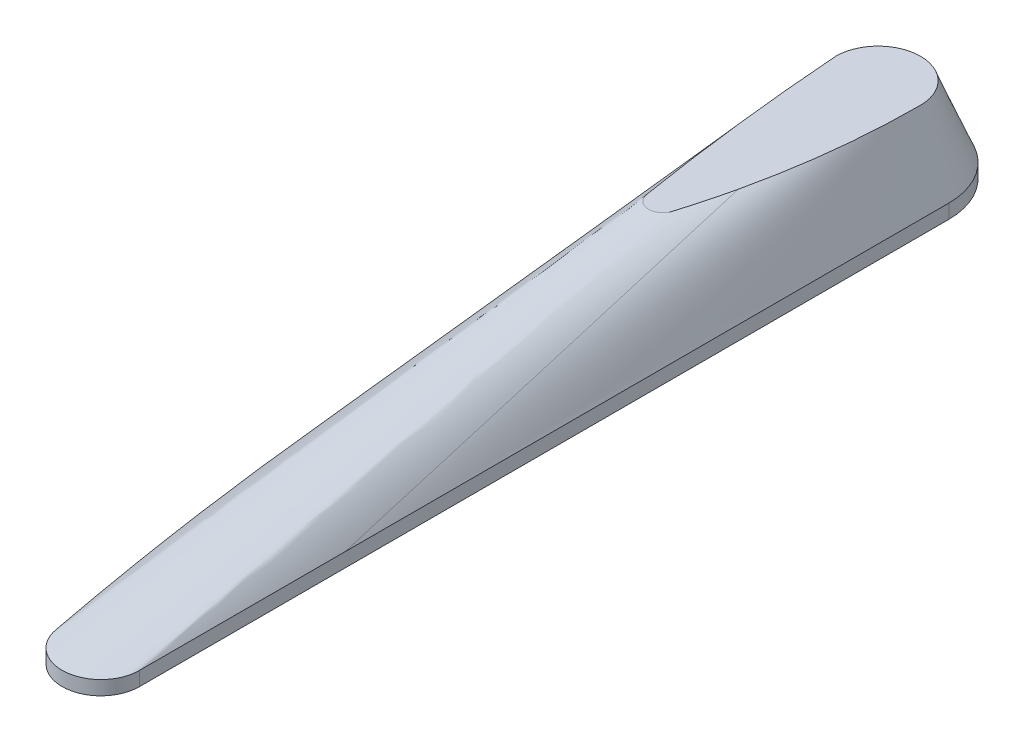
ISO-10303-21;
HEADER;
FILE_DESCRIPTION(('STEP AP214'),'2;1');
FILE_NAME('part.step','',(''),(''),'','','');
FILE_SCHEMA(('AUTOMOTIVE_DESIGN { 1 0 10303 214 1 1 1 1 }'));
ENDSEC;
DATA;
#1=APPLICATION_CONTEXT('core data for automotive mechanical design processes');
#2=APPLICATION_PROTOCOL_DEFINITION('international standard','automotive_design',2000,#1);
#3=PRODUCT_CONTEXT('',#1,'mechanical');
#4=PRODUCT('Part','Part','',(#3));
#5=PRODUCT_RELATED_PRODUCT_CATEGORY('part','',(#4));
#6=PRODUCT_DEFINITION_FORMATION('','',#4);
#7=PRODUCT_DEFINITION_CONTEXT('part definition',#1,'design');
#8=PRODUCT_DEFINITION('design','',#6,#7);
#9=PRODUCT_DEFINITION_SHAPE('','',#8);
#10=(LENGTH_UNIT() NAMED_UNIT(*) SI_UNIT(.MILLI.,.METRE.));
#11=(NAMED_UNIT(*) PLANE_ANGLE_UNIT() SI_UNIT($,.RADIAN.));
#12=(NAMED_UNIT(*) SI_UNIT($,.STERADIAN.) SOLID_ANGLE_UNIT());
#13=UNCERTAINTY_MEASURE_WITH_UNIT(LENGTH_MEASURE(1.E-05),#10,'distance_accuracy_value','');
#14=(GEOMETRIC_REPRESENTATION_CONTEXT(3) GLOBAL_UNCERTAINTY_ASSIGNED_CONTEXT((#13)) GLOBAL_UNIT_ASSIGNED_CONTEXT((#10,
#11,#12)) REPRESENTATION_CONTEXT('',''));
#15=CARTESIAN_POINT('',(0.,0.,0.));
#16=DIRECTION('',(0.,0.,1.));
#17=DIRECTION('',(1.,0.,0.));
#18=AXIS2_PLACEMENT_3D('',#15,#16,#17);
#19=CARTESIAN_POINT('',(0.,5.,0.));
#20=DIRECTION('',(0.,-1.,0.));
#21=DIRECTION('',(0.,0.,-1.));
#22=AXIS2_PLACEMENT_3D('',#19,#20,#21);
#23=CYLINDRICAL_SURFACE('',#22,25.);
#24=CARTESIAN_POINT('',(0.,0.,0.));
#25=DIRECTION('',(0.,1.,0.));
#26=DIRECTION('',(0.,0.,1.));
#27=AXIS2_PLACEMENT_3D('',#24,#25,#26);
#28=CIRCLE('',#27,25.);
#29=CARTESIAN_POINT('',(25.,0.,0.));
#30=VERTEX_POINT('',#29);
#31=CARTESIAN_POINT('',(-25.,0.,0.));
#32=VERTEX_POINT('',#31);
#33=EDGE_CURVE('E451',#30,#32,#28,.T.);
#34=ORIENTED_EDGE('',*,*,#33,.T.);
#35=DIRECTION('',(0.,-1.,0.));
#36=VECTOR('',#35,1.);
#37=CARTESIAN_POINT('',(-25.,5.,0.));
#38=LINE('',#37,#36);
#39=CARTESIAN_POINT('',(-25.,5.,0.));
#40=VERTEX_POINT('',#39);
#41=EDGE_CURVE('E210',#40,#32,#38,.T.);
#42=ORIENTED_EDGE('',*,*,#41,.F.);
#43=CARTESIAN_POINT('',(25.,5.,0.));
#44=CARTESIAN_POINT('',(25.0000015287042,5.00001981175382,-0.265039677965783));
#45=CARTESIAN_POINT('',(24.9957852937944,5.00008696261253,-0.530079262790571));
#46=CARTESIAN_POINT('',(24.9789282878148,5.00021539854403,-1.05989005646571));
#47=CARTESIAN_POINT('',(24.966287527747,5.00027668362449,-1.32466126566609));
#48=CARTESIAN_POINT('',(24.9325919216827,5.00029284484016,-1.85367630226396));
#49=CARTESIAN_POINT('',(24.9115368056182,5.00024771755972,-2.1179201124604));
#50=CARTESIAN_POINT('',(24.8610342903872,5.00008687217403,-2.64560447476436));
#51=CARTESIAN_POINT('',(24.8315868908788,4.99997115406589,-2.90904502683916));
#52=CARTESIAN_POINT('',(24.7643284730527,4.99986193749069,-3.43486380096899));
#53=CARTESIAN_POINT('',(24.7265172273807,4.99986844234642,-3.69724199394845));
#54=CARTESIAN_POINT('',(24.6425701645537,4.99990952299622,-4.22066240605161));
#55=CARTESIAN_POINT('',(24.596434352913,4.99994409877171,-4.48170462606014));
#56=CARTESIAN_POINT('',(24.4959868319933,4.99996614882493,-5.00165883415569));
#57=CARTESIAN_POINT('',(24.441692074504,4.99995371950034,-5.2605740918478));
#58=CARTESIAN_POINT('',(24.3249159442578,4.99991296459885,-5.77654248561465));
#59=CARTESIAN_POINT('',(24.2624345541098,4.99988463898817,-6.03359561773237));
#60=CARTESIAN_POINT('',(24.0628105820831,4.99992841412283,-6.80153307841493));
#61=CARTESIAN_POINT('',(23.9134676456348,5.00012920262583,-7.30930182952002));
#62=CARTESIAN_POINT('',(23.5828921816287,5.00024535469539,-8.31426380576913));
#63=CARTESIAN_POINT('',(23.4016637479709,5.00016075487872,-8.81145837939717));
#64=CARTESIAN_POINT('',(23.0740745298648,5.00002286059824,-9.62863859327918));
#65=CARTESIAN_POINT('',(22.9364029975503,4.9999685823108,-9.95213470523461));
#66=CARTESIAN_POINT('',(22.6475308637945,4.99980480485229,-10.5930587405172));
#67=CARTESIAN_POINT('',(22.4963296366114,4.99969530312607,-10.9104863823557));
#68=CARTESIAN_POINT('',(22.1806908907823,4.99964565142405,-11.5386525052447));
#69=CARTESIAN_POINT('',(22.0162545531562,4.99970548635393,-11.8493915800124));
#70=CARTESIAN_POINT('',(21.6744273575486,4.99992745401653,-12.4636566488229));
#71=CARTESIAN_POINT('',(21.4970366588587,5.00008958549157,-12.7671827314983));
#72=CARTESIAN_POINT('',(21.129684004616,5.00031098116639,-13.3663720495733));
#73=CARTESIAN_POINT('',(20.9397268137994,5.00037028412539,-13.6620382062224));
#74=CARTESIAN_POINT('',(20.5475184943943,5.00036035989201,-14.2451020402767));
#75=CARTESIAN_POINT('',(20.3452673271103,5.00029113229506,-14.5324996916524));
#76=CARTESIAN_POINT('',(19.9288277598403,5.00007417336098,-15.0985189362524));
#77=CARTESIAN_POINT('',(19.7146391940336,4.99992644093311,-15.3771404074839));
#78=CARTESIAN_POINT('',(19.2747099629383,4.99976056888378,-15.9251063539823));
#79=CARTESIAN_POINT('',(19.0489693071228,4.99974242915606,-16.1944508368565));
#80=CARTESIAN_POINT('',(18.5863088833614,4.9997991406477,-16.7234141534915));
#81=CARTESIAN_POINT('',(18.3493880703777,4.99987400057661,-16.9830320740008));
#82=CARTESIAN_POINT('',(17.864832118495,4.9999910960057,-17.4920350921682));
#83=CARTESIAN_POINT('',(17.6171969771167,5.00003333149832,-17.7414201874585));
#84=CARTESIAN_POINT('',(16.8588594339111,5.00006369450702,-18.4735582413242));
#85=CARTESIAN_POINT('',(16.3326204772326,4.99995554090268,-18.9404133422297));
#86=CARTESIAN_POINT('',(15.2426431650757,4.99995802787102,-19.828165765331));
#87=CARTESIAN_POINT('',(14.6788968915958,5.00006871478467,-20.249053333673));
#88=CARTESIAN_POINT('',(13.5179292312595,5.000098818153,-21.0418536144358));
#89=CARTESIAN_POINT('',(12.9207078264022,5.00001823450483,-21.4137663005204));
#90=CARTESIAN_POINT('',(11.697100047189,4.99995386062134,-22.1059250529023));
#91=CARTESIAN_POINT('',(11.0707156108498,4.99997006396318,-22.4261745461576));
#92=CARTESIAN_POINT('',(9.79319264161883,4.99998681037201,-23.0127661592833));
#93=CARTESIAN_POINT('',(9.14205411287923,4.99998735344163,-23.279108288196));
#94=CARTESIAN_POINT('',(7.81970568938631,4.99999282721948,-23.7559712207486));
#95=CARTESIAN_POINT('',(7.14849736419536,4.99999775758545,-23.9664963769264));
#96=CARTESIAN_POINT('',(5.79073196242021,5.00000599903994,-24.3302565618919));
#97=CARTESIAN_POINT('',(5.10417488645565,5.00000931012853,-24.4834915929925));
#98=CARTESIAN_POINT('',(3.7205742289236,5.00000239914589,-24.7315853961882));
#99=CARTESIAN_POINT('',(3.02353036798465,4.99999217671349,-24.8264426102476));
#100=CARTESIAN_POINT('',(1.62392943637039,5.00000112695916,-24.9571000255161));
#101=CARTESIAN_POINT('',(0.921372365362157,5.000020299639,-24.992900223159));
#102=CARTESIAN_POINT('',(-0.484277797098271,5.00004564161192,-25.0051892237259));
#103=CARTESIAN_POINT('',(-1.18737090143737,5.00005181058185,-24.9816765526637));
#104=CARTESIAN_POINT('',(-2.589076964091,5.00001228082691,-24.8755038882613));
#105=CARTESIAN_POINT('',(-3.28768992242217,4.99996658210222,-24.7928438951409));
#106=CARTESIAN_POINT('',(-4.67545916106184,4.99990158114059,-24.5689658029882));
#107=CARTESIAN_POINT('',(-5.36461557370601,4.99988227853388,-24.4277485242766));
#108=CARTESIAN_POINT('',(-6.72858212160635,4.99988115736163,-24.0877600219821));
#109=CARTESIAN_POINT('',(-7.40339225690107,4.99989933879599,-23.8889887985539));
#110=CARTESIAN_POINT('',(-8.73387139010403,4.99994709338837,-23.4353043497546));
#111=CARTESIAN_POINT('',(-9.38954032537246,4.99997666658367,-23.1803909406808));
#112=CARTESIAN_POINT('',(-10.6770716401497,5.00006369072572,-22.6162364921899));
#113=CARTESIAN_POINT('',(-11.3089340209416,5.00012114167096,-22.3069954557009));
#114=CARTESIAN_POINT('',(-12.5443905545814,5.00023152038039,-21.6363647559758));
#115=CARTESIAN_POINT('',(-13.1479835940585,5.00028444796649,-21.2749730411011));
#116=CARTESIAN_POINT('',(-14.3225607583811,5.00027024933434,-20.5026428911266));
#117=CARTESIAN_POINT('',(-14.8935448676276,5.00020312305865,-20.091704432326));
#118=CARTESIAN_POINT('',(-15.9988844289143,4.99993489899596,-19.2231504216806));
#119=CARTESIAN_POINT('',(-16.5332428630122,4.99973381213032,-18.7655386775351));
#120=CARTESIAN_POINT('',(-17.3043159474236,4.99960685432677,-18.0467250351844));
#121=CARTESIAN_POINT('',(-17.5562889073458,4.99959365529618,-17.8016924298901));
#122=CARTESIAN_POINT('',(-18.0496997822869,4.99962816307563,-17.3012072998152));
#123=CARTESIAN_POINT('',(-18.2911376975114,4.99967586988448,-17.0457547752379));
#124=CARTESIAN_POINT('',(-18.7629797950295,4.99977941641623,-16.5249523493818));
#125=CARTESIAN_POINT('',(-18.9933860722288,4.99983525458678,-16.2596043444144));
#126=CARTESIAN_POINT('',(-19.4428111118705,4.99993507183714,-15.7194316952326));
#127=CARTESIAN_POINT('',(-19.6618298749208,4.99997905091758,-15.4446070515243));
#128=CARTESIAN_POINT('',(-20.088090848164,5.00006761015988,-14.8859683223212));
#129=CARTESIAN_POINT('',(-20.2953329495302,5.00011219032729,-14.6021541537929));
#130=CARTESIAN_POINT('',(-20.6976705476457,5.00022119031622,-14.026042860349));
#131=CARTESIAN_POINT('',(-20.8927660435556,5.0002856101391,-13.7337457348471));
#132=CARTESIAN_POINT('',(-21.2705523313112,5.00035819783342,-13.1410488438472));
#133=CARTESIAN_POINT('',(-21.4532372496603,5.00036633925134,-12.8406453345591));
#134=CARTESIAN_POINT('',(-21.8057769035779,5.00031327163407,-12.2324018374529));
#135=CARTESIAN_POINT('',(-21.975631636644,5.00025206258535,-11.9245618481842));
#136=CARTESIAN_POINT('',(-22.3022026829812,5.00008554583951,-11.3020045783023));
#137=CARTESIAN_POINT('',(-22.4589194805743,4.99998023976887,-10.9872875517466));
#138=CARTESIAN_POINT('',(-22.75894280124,4.99986033031918,-10.3515252236371));
#139=CARTESIAN_POINT('',(-22.9022493306535,4.99984572689724,-10.0304799250758));
#140=CARTESIAN_POINT('',(-23.1752976569481,4.99987131508436,-9.38239373319895));
#141=CARTESIAN_POINT('',(-23.3050294005145,4.99991154699881,-9.05534860422486));
#142=CARTESIAN_POINT('',(-23.5505768214901,4.99992984066663,-8.39607441994292));
#143=CARTESIAN_POINT('',(-23.6663924661647,4.99990790227378,-8.06384535244304));
#144=CARTESIAN_POINT('',(-23.883917887997,4.99980719022747,-7.39474401482791));
#145=CARTESIAN_POINT('',(-23.9856254736931,4.99972840775595,-7.05787103226942));
#146=CARTESIAN_POINT('',(-24.1747314931062,4.999582390758,-6.38013539839121));
#147=CARTESIAN_POINT('',(-24.2621300465628,4.99951515613494,-6.03927278048283));
#148=CARTESIAN_POINT('',(-24.422316364277,4.99963617939583,-5.35479050193938));
#149=CARTESIAN_POINT('',(-24.4951306017254,4.99982396945114,-5.0111770360929));
#150=CARTESIAN_POINT('',(-24.6262208602225,5.00025658617395,-4.32117693018169));
#151=CARTESIAN_POINT('',(-24.6844964471698,5.00050141454409,-3.97479020763046));
#152=CARTESIAN_POINT('',(-24.7863749062209,5.00082660237649,-3.28006248357632));
#153=CARTESIAN_POINT('',(-24.8299858545275,5.00090705249052,-2.93172266552048));
#154=CARTESIAN_POINT('',(-24.9024981454978,5.00086955816841,-2.23354936894464));
#155=CARTESIAN_POINT('',(-24.9314011638974,5.00075163634021,-1.88371606516559));
#156=CARTESIAN_POINT('',(-24.9686225541798,5.00046873994703,-1.2780340448867));
#157=CARTESIAN_POINT('',(-24.9803959085718,5.00032515916713,-1.02239227709642));
#158=CARTESIAN_POINT('',(-24.9960804611076,5.00009434643898,-0.511168852314845));
#159=CARTESIAN_POINT('',(-25.0000008968821,5.00000704836575,-0.255587478733737));
#160=CARTESIAN_POINT('',(-25.,5.,0.));
#161=B_SPLINE_CURVE_WITH_KNOTS('',3,(#43,#44,#45,#46,#47,#48,#49,#50,#51,#52,#53,#54,#55,#56,
#57,#58,#59,#60,#61,#62,#63,#64,#65,#66,#67,#68,#69,#70,#71,#72,#73,#74,#75,#76,#77,#78,#79,#80,
#81,#82,#83,#84,#85,#86,#87,#88,#89,#90,#91,#92,#93,#94,#95,#96,#97,#98,#99,#100,#101,#102,#103,
#104,#105,#106,#107,#108,#109,#110,#111,#112,#113,#114,#115,#116,#117,#118,#119,#120,#121,#122,
#123,#124,#125,#126,#127,#128,#129,#130,#131,#132,#133,#134,#135,#136,#137,#138,#139,#140,#141,
#142,#143,#144,#145,#146,#147,#148,#149,#150,#151,#152,#153,#154,#155,#156,#157,#158,#159,#160),
.UNSPECIFIED.,.F.,.F.,(4,2,2,2,2,2,2,2,2,2,2,2,2,2,2,2,2,2,2,2,2,2,2,2,2,2,2,2,2,2,2,2,2,2,2,2,
2,2,2,2,2,2,2,2,2,2,2,2,2,2,2,2,2,2,2,2,2,2,4),(0.,0.795085377684337,1.5901697170187,
2.38527957749968,3.18038947037979,3.97552097938242,4.77065196169254,5.56415318083524,
6.35765608568007,7.94433750918174,9.53081536109621,10.5852452250893,11.6397238811831,
12.694108546171,13.7484802482383,14.8024544389078,15.8564319471478,16.9104240996837,
17.9644153879161,19.0185053912937,20.072595638574,22.1803018172138,24.2884543648011,
26.3966080460417,28.5046218302524,30.6126352608742,32.7204842628649,34.8283331797615,
36.9362383502431,39.0441436480162,41.1521013299399,43.2600590040309,45.3679871490445,
47.4759152883952,49.5838503251919,51.6917852483739,53.7998031215913,55.9078220031949,
58.01566904579,59.0698243776562,60.1239796889423,61.1779340158657,62.231888286518,
63.2858522950565,64.3398163764272,65.394275836753,66.4487355027504,67.5031562796215,
68.5575765579079,69.612772280472,70.6679704851107,71.72333241482,72.7786855126794,
73.8321052365918,74.8855564102133,75.9384264666698,76.9911765383619,77.7588002738327,
78.5255204982596),.UNSPECIFIED.);
#162=CARTESIAN_POINT('',(25.,5.,0.));
#163=VERTEX_POINT('',#162);
#164=EDGE_CURVE('E407',#163,#40,#161,.T.);
#165=ORIENTED_EDGE('',*,*,#164,.F.);
#166=DIRECTION('',(0.,-1.,0.));
#167=VECTOR('',#166,1.);
#168=CARTESIAN_POINT('',(25.,5.,0.));
#169=LINE('',#168,#167);
#170=EDGE_CURVE('E216',#163,#30,#169,.T.);
#171=ORIENTED_EDGE('',*,*,#170,.T.);
#172=EDGE_LOOP('',(#34,#42,#165,#171));
#173=FACE_BOUND('',#172,.T.);
#174=ADVANCED_FACE('F163',(#173),#23,.T.);
#175=CARTESIAN_POINT('',(-25.,5.,0.));
#176=DIRECTION('',(1.,0.,0.));
#177=DIRECTION('',(0.,0.,-1.));
#178=AXIS2_PLACEMENT_3D('',#175,#176,#177);
#179=PLANE('',#178);
#180=DIRECTION('',(0.,0.,1.));
#181=VECTOR('',#180,1.);
#182=CARTESIAN_POINT('',(-25.,0.,0.));
#183=LINE('',#182,#181);
#184=CARTESIAN_POINT('',(-24.9999999999999,0.,50.0000000000001));
#185=VERTEX_POINT('',#184);
#186=EDGE_CURVE('E274',#32,#185,#183,.T.);
#187=ORIENTED_EDGE('',*,*,#186,.T.);
#188=DIRECTION('',(0.,-1.,0.));
#189=VECTOR('',#188,1.);
#190=CARTESIAN_POINT('',(-24.9999999999999,5.,50.0000000000001));
#191=LINE('',#190,#189);
#192=CARTESIAN_POINT('',(-24.9999999999999,5.,50.0000000000001));
#193=VERTEX_POINT('',#192);
#194=EDGE_CURVE('E12',#193,#185,#191,.T.);
#195=ORIENTED_EDGE('',*,*,#194,.F.);
#196=DIRECTION('',(0.,0.,-1.));
#197=VECTOR('',#196,1.);
#198=CARTESIAN_POINT('',(-25.,5.,0.));
#199=LINE('',#198,#197);
#200=EDGE_CURVE('E400',#40,#193,#199,.F.);
#201=ORIENTED_EDGE('',*,*,#200,.F.);
#202=ORIENTED_EDGE('',*,*,#41,.T.);
#203=EDGE_LOOP('',(#187,#195,#201,#202));
#204=FACE_BOUND('',#203,.T.);
#205=ADVANCED_FACE('F165',(#204),#179,.F.);
#206=CARTESIAN_POINT('',(1237.5,5.,50.));
#207=DIRECTION('',(0.,-1.,0.));
#208=DIRECTION('',(0.,0.,-1.));
#209=AXIS2_PLACEMENT_3D('',#206,#207,#208);
#210=CYLINDRICAL_SURFACE('',#209,1262.5);
#211=CARTESIAN_POINT('',(1237.5,0.,50.));
#212=DIRECTION('',(0.,1.,0.));
#213=DIRECTION('',(0.,0.,1.));
#214=AXIS2_PLACEMENT_3D('',#211,#212,#213);
#215=CIRCLE('',#214,1262.5);
#216=CARTESIAN_POINT('',(-2.19561294288009,0.,288.874521977913));
#217=VERTEX_POINT('',#216);
#218=EDGE_CURVE('E441',#185,#217,#215,.T.);
#219=ORIENTED_EDGE('',*,*,#218,.T.);
#220=DIRECTION('',(0.,-1.,0.));
#221=VECTOR('',#220,1.);
#222=CARTESIAN_POINT('',(-2.19561294288009,5.,288.874521977913));
#223=LINE('',#222,#221);
#224=CARTESIAN_POINT('',(-2.19561294288012,5.,288.874521977913));
#225=VERTEX_POINT('',#224);
#226=EDGE_CURVE('E173',#225,#217,#223,.T.);
#227=ORIENTED_EDGE('',*,*,#226,.F.);
#228=CARTESIAN_POINT('',(-24.9999999999999,5.,50.0000000000001));
#229=CARTESIAN_POINT('',(-25.0000001291701,4.99999701572637,51.9276937265416));
#230=CARTESIAN_POINT('',(-24.9955849950269,4.99997778194491,53.8553934272774));
#231=CARTESIAN_POINT('',(-24.9690942596424,4.99989569438115,59.6384704670889));
#232=CARTESIAN_POINT('',(-24.9337731864831,4.99980845429835,63.493795405953));
#233=CARTESIAN_POINT('',(-24.8543033641688,4.99972627528363,69.2763815538292));
#234=CARTESIAN_POINT('',(-24.8233988949981,4.99970699577706,71.2038358105018));
#235=CARTESIAN_POINT('',(-24.7527612541059,4.99968796305314,75.0585852978676));
#236=CARTESIAN_POINT('',(-24.7130280823845,4.99968820983578,76.9858805285608));
#237=CARTESIAN_POINT('',(-24.6468075354846,4.99970412404551,79.8766670532909));
#238=CARTESIAN_POINT('',(-24.623630581017,4.9997120194393,80.840235560326));
#239=CARTESIAN_POINT('',(-24.5507893771218,4.99974274382275,83.730861976522));
#240=CARTESIAN_POINT('',(-24.4978148653623,4.99977261101109,85.6578369895246));
#241=CARTESIAN_POINT('',(-24.3256507132629,4.99988343747892,91.4384059358001));
#242=CARTESIAN_POINT('',(-24.193221081426,4.99998562152518,95.2916134445537));
#243=CARTESIAN_POINT('',(-23.8930367396057,5.00015752402885,102.997427629649));
#244=CARTESIAN_POINT('',(-23.7252748883542,5.00022723591389,106.850034026722));
#245=CARTESIAN_POINT('',(-23.3544555479658,5.00022215006293,114.553562799149));
#246=CARTESIAN_POINT('',(-23.1513979239073,5.00014735177451,118.404485168008));
#247=CARTESIAN_POINT('',(-22.7100018871953,5.00000557334284,126.104348272734));
#248=CARTESIAN_POINT('',(-22.4716631420403,4.99993859327328,129.953288989582));
#249=CARTESIAN_POINT('',(-21.9597284827251,4.99986266333827,137.648807941507));
#250=CARTESIAN_POINT('',(-21.6861325598681,4.99985371348712,141.495386176002));
#251=CARTESIAN_POINT('',(-20.8125882123956,4.99992647869728,153.029801409644));
#252=CARTESIAN_POINT('',(-20.1598018489585,5.00010776850857,160.713738150991));
#253=CARTESIAN_POINT('',(-19.0751457937575,5.0001290168771,172.229370001055));
#254=CARTESIAN_POINT('',(-18.6960211543775,5.00009432112739,176.066141431777));
#255=CARTESIAN_POINT('',(-17.5057788110506,4.99997771715916,187.572615005008));
#256=CARTESIAN_POINT('',(-16.6419229667316,4.99988330107977,195.236942845862));
#257=CARTESIAN_POINT('',(-14.7739014833554,4.99992519450469,210.548463846787));
#258=CARTESIAN_POINT('',(-13.7697358772738,5.00006150395479,218.195657010884));
#259=CARTESIAN_POINT('',(-12.1586345201681,5.00011109317121,229.650805872566));
#260=CARTESIAN_POINT('',(-11.604185733971,5.00010181905717,233.466202475441));
#261=CARTESIAN_POINT('',(-10.4603583338023,5.00004690998177,241.091754000732));
#262=CARTESIAN_POINT('',(-9.8709797198317,5.00000127502041,244.901908923148));
#263=CARTESIAN_POINT('',(-8.1944366777203,4.99991107865561,255.421058361582));
#264=CARTESIAN_POINT('',(-7.07050653722405,4.99989389076473,262.12424405096));
#265=CARTESIAN_POINT('',(-5.30341445441502,4.99992637180452,272.165427141245));
#266=CARTESIAN_POINT('',(-4.70077492086949,4.99994691516989,275.510616831841));
#267=CARTESIAN_POINT('',(-3.46845716610411,4.99998315953063,282.196237843295));
#268=CARTESIAN_POINT('',(-2.83877718336424,4.99999886020999,285.536668839464));
#269=CARTESIAN_POINT('',(-2.19561294288007,5.,288.874521977913));
#270=B_SPLINE_CURVE_WITH_KNOTS('',3,(#228,#229,#230,#231,#232,#233,#234,#235,#236,#237,#238,
#239,#240,#241,#242,#243,#244,#245,#246,#247,#248,#249,#250,#251,#252,#253,#254,#255,#256,#257,
#258,#259,#260,#261,#262,#263,#264,#265,#266,#267,#268,#269),.UNSPECIFIED.,.F.,.F.,(4,2,2,2,2,2,
2,2,2,2,2,2,2,2,2,2,2,2,2,2,4),(0.,5.78309082983835,17.349363500359,23.1324543300358,
28.9155451597412,31.8070848865568,37.5901757162404,49.1564483868097,60.7250610535075,
72.2937179433161,83.8624838670456,95.431252644425,118.564526175925,130.130798846956,
153.267960839986,176.405117395314,187.971390066138,199.53766273664,219.926895767822,
230.123922963938,240.321615444755),.UNSPECIFIED.);
#271=EDGE_CURVE('E203',#193,#225,#270,.T.);
#272=ORIENTED_EDGE('',*,*,#271,.F.);
#273=ORIENTED_EDGE('',*,*,#194,.T.);
#274=EDGE_LOOP('',(#219,#227,#272,#273));
#275=FACE_BOUND('',#274,.T.);
#276=ADVANCED_FACE('F434',(#275),#210,.T.);
#277=CARTESIAN_POINT('',(11.2782665101052,5.,286.278266510105));
#278=DIRECTION('',(0.,-1.,0.));
#279=DIRECTION('',(0.,0.,-1.));
#280=AXIS2_PLACEMENT_3D('',#277,#278,#279);
#281=CYLINDRICAL_SURFACE('',#280,13.7217334898947);
#282=CARTESIAN_POINT('',(11.2782665101052,0.,286.278266510105));
#283=DIRECTION('',(0.,1.,0.));
#284=DIRECTION('',(0.,0.,1.));
#285=AXIS2_PLACEMENT_3D('',#282,#283,#284);
#286=CIRCLE('',#285,13.7217334898947);
#287=CARTESIAN_POINT('',(24.9999999999999,0.,286.278266510105));
#288=VERTEX_POINT('',#287);
#289=EDGE_CURVE('E445',#217,#288,#286,.T.);
#290=ORIENTED_EDGE('',*,*,#289,.T.);
#291=DIRECTION('',(0.,-1.,0.));
#292=VECTOR('',#291,1.);
#293=CARTESIAN_POINT('',(24.9999999999999,5.,286.278266510105));
#294=LINE('',#293,#292);
#295=CARTESIAN_POINT('',(25.,5.,286.278266510105));
#296=VERTEX_POINT('',#295);
#297=EDGE_CURVE('E405',#296,#288,#294,.T.);
#298=ORIENTED_EDGE('',*,*,#297,.F.);
#299=CARTESIAN_POINT('',(-2.19561294288016,5.,288.874521977913));
#300=CARTESIAN_POINT('',(-2.13030277704205,5.00000574833122,289.213604125432));
#301=CARTESIAN_POINT('',(-2.05214305843208,5.00000645872406,289.550205586985));
#302=CARTESIAN_POINT('',(-1.87055605686816,5.00000288381724,290.217024006664));
#303=CARTESIAN_POINT('',(-1.76709393796044,4.99999859159911,290.547231479406));
#304=CARTESIAN_POINT('',(-1.53430031389705,4.99999005929102,291.202314721171));
#305=CARTESIAN_POINT('',(-1.40470828264672,4.99998582022345,291.527097944387));
#306=CARTESIAN_POINT('',(-1.12107706040952,4.99998599509215,292.165915013288));
#307=CARTESIAN_POINT('',(-0.967031057616654,4.99999041144333,292.479945834107));
#308=CARTESIAN_POINT('',(-0.63526239528394,5.00000545584867,293.095611090033));
#309=CARTESIAN_POINT('',(-0.457518428345856,5.00001608952244,293.397234045783));
#310=CARTESIAN_POINT('',(-0.0795021898836555,5.00002372008603,293.986020129832));
#311=CARTESIAN_POINT('',(0.120770822657868,5.00002071652717,294.273182782059));
#312=CARTESIAN_POINT('',(0.564322690900242,5.00000853861729,294.859999339613));
#313=CARTESIAN_POINT('',(0.80990555925266,4.9999987632247,295.157915831725));
#314=CARTESIAN_POINT('',(1.3253102655874,4.99998704318495,295.73202068812));
#315=CARTESIAN_POINT('',(1.5951342351149,4.99998509922711,296.008207137645));
#316=CARTESIAN_POINT('',(2.15710837316156,4.99999197480585,296.536886160244));
#317=CARTESIAN_POINT('',(2.44925991214744,5.00000079500363,296.789377276775));
#318=CARTESIAN_POINT('',(3.05378898070764,5.00001285241331,297.268843095568));
#319=CARTESIAN_POINT('',(3.36616606714476,5.00001608974748,297.495818356578));
#320=CARTESIAN_POINT('',(4.00892452592183,5.00000789482876,297.922641216358));
#321=CARTESIAN_POINT('',(4.33930550922614,4.99999646289274,298.122489400975));
#322=CARTESIAN_POINT('',(5.0157306953224,4.99998214251464,298.493643817428));
#323=CARTESIAN_POINT('',(5.36177497985513,4.99997925411715,298.664949900291));
#324=CARTESIAN_POINT('',(6.06705201420718,4.9999850409359,298.977795238664));
#325=CARTESIAN_POINT('',(6.42628428109749,4.9999937157291,299.119335582886));
#326=CARTESIAN_POINT('',(7.15539493285018,5.00001221085657,299.371650950499));
#327=CARTESIAN_POINT('',(7.52527330466265,5.00002203118942,299.482426011599));
#328=CARTESIAN_POINT('',(8.27305130694034,5.00002129647249,299.672424605344));
#329=CARTESIAN_POINT('',(8.65095102821262,5.00001074119193,299.751647780598));
#330=CARTESIAN_POINT('',(9.41208117268005,4.99999342997534,299.877977605606));
#331=CARTESIAN_POINT('',(9.79531159739136,4.99998667404039,299.925084246225));
#332=CARTESIAN_POINT('',(10.564383453004,4.99998408088338,299.986846464481));
#333=CARTESIAN_POINT('',(10.9502249171575,4.99998824380064,300.001501628058));
#334=CARTESIAN_POINT('',(11.7217708501512,5.00000268380664,299.998255477978));
#335=CARTESIAN_POINT('',(12.1074753189979,5.00001296089511,299.980354165874));
#336=CARTESIAN_POINT('',(12.8760033524469,5.00001556987717,299.912122494109));
#337=CARTESIAN_POINT('',(13.2588269302666,5.00000790185315,299.861792283324));
#338=CARTESIAN_POINT('',(14.0188733206504,4.99999325146161,299.729060773657));
#339=CARTESIAN_POINT('',(14.3960961331759,4.99998626909411,299.646659474555));
#340=CARTESIAN_POINT('',(15.1422577967666,4.99998355056096,299.450371970803));
#341=CARTESIAN_POINT('',(15.5111966778893,4.9999878143545,299.336485880414));
#342=CARTESIAN_POINT('',(16.2381689492983,5.00000435901452,299.078038332673));
#343=CARTESIAN_POINT('',(16.5962023401351,5.0000166398806,298.93347687687));
#344=CARTESIAN_POINT('',(17.2988244725915,5.00002362692881,298.614703515771));
#345=CARTESIAN_POINT('',(17.6434129764736,5.00001833280032,298.440491086468));
#346=CARTESIAN_POINT('',(18.3166888621809,5.00000144815465,298.063656069603));
#347=CARTESIAN_POINT('',(18.6453762387233,4.99998985763538,297.861033472602));
#348=CARTESIAN_POINT('',(19.2845028738722,4.99997843032128,297.428825520609));
#349=CARTESIAN_POINT('',(19.594942704089,4.99997859315808,297.199241010882));
#350=CARTESIAN_POINT('',(20.1953779689775,4.99999023860586,296.714736683425));
#351=CARTESIAN_POINT('',(20.4853734365541,5.00000172119863,296.459816906472));
#352=CARTESIAN_POINT('',(21.0428287837853,5.00001506838639,295.926482820218));
#353=CARTESIAN_POINT('',(21.3102910922021,5.00001693401926,295.648071049519));
#354=CARTESIAN_POINT('',(21.820815727796,5.0000073829689,295.069706223988));
#355=CARTESIAN_POINT('',(22.063877896096,4.99999596619918,294.769753028916));
#356=CARTESIAN_POINT('',(22.5239308937595,4.99998402010071,294.150360523751));
#357=CARTESIAN_POINT('',(22.7409151120788,4.99998349352697,293.830916303286));
#358=CARTESIAN_POINT('',(23.1471922657163,4.99999333634247,293.174890673336));
#359=CARTESIAN_POINT('',(23.3364859367604,5.00000370544216,292.838309719487));
#360=CARTESIAN_POINT('',(23.6861341382689,5.00002234572474,292.15021687128));
#361=CARTESIAN_POINT('',(23.8464735051351,5.00003061580927,291.798697271789));
#362=CARTESIAN_POINT('',(24.1369497525679,5.00002336622951,291.083393008024));
#363=CARTESIAN_POINT('',(24.2670867359721,5.00000784664623,290.719608385518));
#364=CARTESIAN_POINT('',(24.4961124905858,4.99998345670624,289.982753405516));
#365=CARTESIAN_POINT('',(24.5950336253543,4.9999745794498,289.609693100655));
#366=CARTESIAN_POINT('',(24.7610764668977,4.99997101594477,288.856708672103));
#367=CARTESIAN_POINT('',(24.8282118276549,4.99997632359636,288.476787568497));
#368=CARTESIAN_POINT('',(24.9194694453082,4.99998842520607,287.793500167616));
#369=CARTESIAN_POINT('',(24.9496850693216,4.99999466758846,287.490932716038));
#370=CARTESIAN_POINT('',(24.9899384153475,5.00000245734676,286.885005834949));
#371=CARTESIAN_POINT('',(25.0000123521338,5.0000040131517,286.581648810607));
#372=CARTESIAN_POINT('',(25.0000000000001,5.,286.278266510107));
#373=B_SPLINE_CURVE_WITH_KNOTS('',3,(#299,#300,#301,#302,#303,#304,#305,#306,#307,#308,#309,
#310,#311,#312,#313,#314,#315,#316,#317,#318,#319,#320,#321,#322,#323,#324,#325,#326,#327,#328,
#329,#330,#331,#332,#333,#334,#335,#336,#337,#338,#339,#340,#341,#342,#343,#344,#345,#346,#347,
#348,#349,#350,#351,#352,#353,#354,#355,#356,#357,#358,#359,#360,#361,#362,#363,#364,#365,#366,
#367,#368,#369,#370,#371,#372),.UNSPECIFIED.,.F.,.F.,(4,2,2,2,2,2,2,2,2,2,2,2,2,2,2,2,2,2,2,2,2,
2,2,2,2,2,2,2,2,2,2,2,2,2,2,2,4),(0.,1.03568950953112,2.07281304821526,3.12083970025513,
4.16915880057506,5.21842690708196,6.26772953584129,7.42460296910032,8.58157822719015,
9.73862455757149,10.8956455459011,12.0526415427495,13.2096435782143,14.3666032877514,
15.5235615791583,16.6805329751023,17.8375047001213,18.9944911872741,20.151477619293,
21.3084587398393,22.4654398683702,23.6224167982189,24.7793936696581,25.9363909899281,
27.0933886945976,28.2503501366105,29.4073097164622,30.5641444321356,31.7209866798371,
32.8781215837744,34.0352257375506,35.1929341295242,36.3506385794949,37.5071387860814,
38.6631417515957,39.5747124516508,40.4846426674341),.UNSPECIFIED.);
#374=EDGE_CURVE('E423',#225,#296,#373,.T.);
#375=ORIENTED_EDGE('',*,*,#374,.F.);
#376=ORIENTED_EDGE('',*,*,#226,.T.);
#377=EDGE_LOOP('',(#290,#298,#375,#376));
#378=FACE_BOUND('',#377,.T.);
#379=ADVANCED_FACE('F429',(#378),#281,.T.);
#380=CARTESIAN_POINT('',(25.,5.,0.));
#381=DIRECTION('',(1.,0.,0.));
#382=DIRECTION('',(0.,0.,-1.));
#383=AXIS2_PLACEMENT_3D('',#380,#381,#382);
#384=PLANE('',#383);
#385=DIRECTION('',(0.,0.,1.));
#386=VECTOR('',#385,1.);
#387=CARTESIAN_POINT('',(25.,0.,0.));
#388=LINE('',#387,#386);
#389=EDGE_CURVE('E449',#30,#288,#388,.T.);
#390=ORIENTED_EDGE('',*,*,#389,.F.);
#391=ORIENTED_EDGE('',*,*,#170,.F.);
#392=DIRECTION('',(0.,0.,-1.));
#393=VECTOR('',#392,1.);
#394=CARTESIAN_POINT('',(25.,5.,0.));
#395=LINE('',#394,#393);
#396=CARTESIAN_POINT('',(25.,5.,213.549196181388));
#397=VERTEX_POINT('',#396);
#398=EDGE_CURVE('E182',#163,#397,#395,.F.);
#399=ORIENTED_EDGE('',*,*,#398,.T.);
#400=DIRECTION('',(0.,0.,-1.));
#401=VECTOR('',#400,1.);
#402=CARTESIAN_POINT('',(25.,5.,0.));
#403=LINE('',#402,#401);
#404=EDGE_CURVE('E343',#296,#397,#403,.T.);
#405=ORIENTED_EDGE('',*,*,#404,.F.);
#406=ORIENTED_EDGE('',*,*,#297,.T.);
#407=EDGE_LOOP('',(#390,#391,#399,#405,#406));
#408=FACE_BOUND('',#407,.T.);
#409=ADVANCED_FACE('F433',(#408),#384,.T.);
#410=CARTESIAN_POINT('',(0.,0.,0.));
#411=DIRECTION('',(0.,1.,0.));
#412=DIRECTION('',(0.,0.,1.));
#413=AXIS2_PLACEMENT_3D('',#410,#411,#412);
#414=PLANE('',#413);
#415=ORIENTED_EDGE('',*,*,#186,.F.);
#416=ORIENTED_EDGE('',*,*,#33,.F.);
#417=ORIENTED_EDGE('',*,*,#389,.T.);
#418=ORIENTED_EDGE('',*,*,#289,.F.);
#419=ORIENTED_EDGE('',*,*,#218,.F.);
#420=EDGE_LOOP('',(#415,#416,#417,#418,#419));
#421=FACE_BOUND('',#420,.T.);
#422=ADVANCED_FACE('F286',(#421),#414,.F.);
#423=CARTESIAN_POINT('',(419.678496763024,30.,6.54727693341048));
#424=DIRECTION('',(0.,1.,0.));
#425=DIRECTION('',(0.,0.,1.));
#426=AXIS2_PLACEMENT_3D('',#423,#424,#425);
#427=PLANE('',#426);
#428=CARTESIAN_POINT('',(840.53248838004,30.,-61.905446133179));
#429=DIRECTION('',(0.,1.,0.));
#430=DIRECTION('',(0.,0.,1.));
#431=AXIS2_PLACEMENT_3D('',#428,#429,#430);
#432=CIRCLE('',#431,857.769271386363);
#433=CARTESIAN_POINT('',(-15.,30.,0.));
#434=VERTEX_POINT('',#433);
#435=CARTESIAN_POINT('',(-6.11063974883404,30.,75.8027109485495));
#436=VERTEX_POINT('',#435);
#437=EDGE_CURVE('E248',#434,#436,#432,.T.);
#438=ORIENTED_EDGE('',*,*,#437,.T.);
#439=CARTESIAN_POINT('',(-1.17549485399272,30.,75.));
#440=DIRECTION('',(0.,1.,0.));
#441=DIRECTION('',(0.,0.,1.));
#442=AXIS2_PLACEMENT_3D('',#439,#440,#441);
#443=CIRCLE('',#442,4.99999999999994);
#444=CARTESIAN_POINT('',(3.60729812356481,30.,76.4577007010449));
#445=VERTEX_POINT('',#444);
#446=EDGE_CURVE('E242',#436,#445,#443,.T.);
#447=ORIENTED_EDGE('',*,*,#446,.T.);
#448=CARTESIAN_POINT('',(-247.254455411311,30.,0.));
#449=DIRECTION('',(0.,1.,0.));
#450=DIRECTION('',(0.,0.,-1.));
#451=AXIS2_PLACEMENT_3D('',#448,#449,#450);
#452=CIRCLE('',#451,262.254455411311);
#453=CARTESIAN_POINT('',(8.51819077009408,30.,57.9438897979164));
#454=VERTEX_POINT('',#453);
#455=EDGE_CURVE('E252',#445,#454,#452,.T.);
#456=ORIENTED_EDGE('',*,*,#455,.T.);
#457=CARTESIAN_POINT('',(15.,30.,0.));
#458=VERTEX_POINT('',#457);
#459=EDGE_CURVE('E256',#454,#458,#452,.T.);
#460=ORIENTED_EDGE('',*,*,#459,.T.);
#461=CARTESIAN_POINT('',(0.,30.,0.));
#462=DIRECTION('',(0.,1.,0.));
#463=DIRECTION('',(0.,0.,1.));
#464=AXIS2_PLACEMENT_3D('',#461,#462,#463);
#465=CIRCLE('',#464,15.);
#466=EDGE_CURVE('E263',#458,#434,#465,.T.);
#467=ORIENTED_EDGE('',*,*,#466,.T.);
#468=EDGE_LOOP('',(#438,#447,#456,#460,#467));
#469=FACE_BOUND('',#468,.T.);
#470=ADVANCED_FACE('F261',(#469),#427,.T.);
#471=CARTESIAN_POINT('',(25.1648180922991,4.75,215.105249245222));
#472=CARTESIAN_POINT('',(25.,5.,213.549196181388));
#473=CARTESIAN_POINT('',(8.51819077009408,30.,57.9438897979164));
#474=CARTESIAN_POINT('',(25.1509734130243,4.75,190.17173527426));
#475=CARTESIAN_POINT('',(25.,5.,188.802031229618));
#476=CARTESIAN_POINT('',(9.90265869757216,30.,51.8316267654559));
#477=CARTESIAN_POINT('',(25.1336514343865,4.75,152.290586192323));
#478=CARTESIAN_POINT('',(25.,5.,151.205389154418));
#479=CARTESIAN_POINT('',(11.6348565613515,30.,42.685685363892));
#480=CARTESIAN_POINT('',(25.1168730873811,4.75,103.0501399802));
#481=CARTESIAN_POINT('',(25.,5.,102.328922486299));
#482=CARTESIAN_POINT('',(13.3126912618937,30.,30.2071730962409));
#483=CARTESIAN_POINT('',(25.1074949599785,4.75,67.1452298727496));
#484=CARTESIAN_POINT('',(25.,5.,66.6844168072283));
#485=CARTESIAN_POINT('',(14.2505040021489,30.,20.6031102551013));
#486=CARTESIAN_POINT('',(25.1014959111598,4.75,32.6574521651717));
#487=CARTESIAN_POINT('',(25.,5.,32.4394050561175));
#488=CARTESIAN_POINT('',(14.850408884022,30.,10.6346941506996));
#489=CARTESIAN_POINT('',(25.1,4.75,10.6987800522231));
#490=CARTESIAN_POINT('',(25.,5.,10.628825063537));
#491=CARTESIAN_POINT('',(15.,30.,3.63332619492832));
#492=CARTESIAN_POINT('',(25.1,4.75,-1.15050477263783));
#493=CARTESIAN_POINT('',(25.,5.,-1.14298208801412));
#494=CARTESIAN_POINT('',(15.,30.,-0.390713625642472));
#495=CARTESIAN_POINT('',(24.9432567303663,4.75,-3.35149639652384));
#496=CARTESIAN_POINT('',(24.8445052059641,5.,-3.33001616900886));
#497=CARTESIAN_POINT('',(14.9693527657466,30.,-1.18199341751103));
#498=CARTESIAN_POINT('',(24.3373682179584,4.75,-6.38148503855406));
#499=CARTESIAN_POINT('',(24.2431901137015,5.,-6.34196447363819));
#500=CARTESIAN_POINT('',(14.8253796880128,30.,-2.38990798205108));
#501=CARTESIAN_POINT('',(23.4290651091916,4.74999999999999,-9.15760857288489));
#502=CARTESIAN_POINT('',(23.3414243047474,4.99999999999999,-9.10268427689905));
#503=CARTESIAN_POINT('',(14.5773438603316,30.,-3.61025467831476));
#504=CARTESIAN_POINT('',(21.881164524679,4.75000000000001,-12.5361934550297));
#505=CARTESIAN_POINT('',(21.8041212956429,5.00000000000001,-12.4639790919992));
#506=CARTESIAN_POINT('',(14.0997983920354,30.,-5.24254278894636));
#507=CARTESIAN_POINT('',(19.4194908324246,4.74999999999999,-16.1765751146287));
#508=CARTESIAN_POINT('',(19.358034557488,4.99999999999999,-16.0884027821223));
#509=CARTESIAN_POINT('',(13.2124070638286,30.,-7.27116953147694));
#510=CARTESIAN_POINT('',(15.8618550215264,4.75000000000001,-19.6575442163624));
#511=CARTESIAN_POINT('',(15.8202886437149,5.00000000000001,-19.5577232659311));
#512=CARTESIAN_POINT('',(11.6636508625601,29.9999999999999,-9.57562822280296));
#513=CARTESIAN_POINT('',(11.8778543888922,4.74999999999998,-22.2795612326928));
#514=CARTESIAN_POINT('',(11.8554187675665,4.99999999999999,-22.1742098694772));
#515=CARTESIAN_POINT('',(9.61185663498918,30.,-11.639073547922));
#516=CARTESIAN_POINT('',(7.6123983710527,4.75000000000001,-24.0649350346958));
#517=CARTESIAN_POINT('',(7.60742574498049,5.00000000000001,-23.9586342959986));
#518=CARTESIAN_POINT('',(7.11016313775975,30.,-13.3285604262708));
#519=CARTESIAN_POINT('',(3.19122822664079,4.74999999999999,-25.0323677918334));
#520=CARTESIAN_POINT('',(3.20133199793658,4.99999999999999,-24.9281972570359));
#521=CARTESIAN_POINT('',(4.21170912751552,29.9999999999999,-14.5111437772865));
#522=CARTESIAN_POINT('',(-1.27362581385972,4.75,-25.1997640666328));
#523=CARTESIAN_POINT('',(-1.25054135859593,5.00000000000001,-25.0995586351633));
#524=CARTESIAN_POINT('',(1.0579041677831,30.0000000000001,-15.0790154882072));
#525=CARTESIAN_POINT('',(-5.674815730133,4.75,-24.5843136026607));
#526=CARTESIAN_POINT('',(-5.64041090361923,5.,-24.4889948991956));
#527=CARTESIAN_POINT('',(-2.19992825224225,29.9999999999999,-14.957124552684));
#528=CARTESIAN_POINT('',(-9.90973963422328,4.74999999999999,-23.2046578535226));
#529=CARTESIAN_POINT('',(-9.86477067547618,4.99999999999999,-23.114839028266));
#530=CARTESIAN_POINT('',(-5.36787480076588,30.0000000000001,-14.1329565026017));
#531=CARTESIAN_POINT('',(-13.2146593413508,4.75,-21.4331420431311));
#532=CARTESIAN_POINT('',(-13.1608907063375,5.,-21.3486598393008));
#533=CARTESIAN_POINT('',(-7.78402720499937,29.9999999999998,-12.9004394562721));
#534=CARTESIAN_POINT('',(-15.6676539888548,4.75,-19.6538883385176));
#535=CARTESIAN_POINT('',(-15.6066258372944,5.,-19.5745543603747));
#536=CARTESIAN_POINT('',(-9.50381068125913,30.0000000000001,-11.6411565460815));
#537=CARTESIAN_POINT('',(-17.9744342846364,4.75,-17.6369174498036));
#538=CARTESIAN_POINT('',(-17.9060360303232,5.,-17.5634966129993));
#539=CARTESIAN_POINT('',(-11.0662105990082,29.9999999999999,-10.2214129325687));
#540=CARTESIAN_POINT('',(-20.5483774437565,4.74999999999999,-14.6767169088429));
#541=CARTESIAN_POINT('',(-20.4705313715437,4.99999999999999,-14.6125560817881));
#542=CARTESIAN_POINT('',(-12.6859241502643,30.0000000000001,-8.19647337630736));
#543=CARTESIAN_POINT('',(-23.0029803754111,4.75000000000001,-10.4494846807918));
#544=CARTESIAN_POINT('',(-22.9143813690061,5.00000000000001,-10.4006034040164));
#545=CARTESIAN_POINT('',(-14.0544807285084,30.,-5.51247572646975));
#546=CARTESIAN_POINT('',(-24.6628537798142,4.74999999999999,-5.57685088983098));
#547=CARTESIAN_POINT('',(-24.5655669973559,4.99999999999999,-5.54871312989638));
#548=CARTESIAN_POINT('',(-14.8368887515299,30.,-2.73493713643619));
#549=CARTESIAN_POINT('',(-25.1,4.75,-1.9220776154864));
#550=CARTESIAN_POINT('',(-25.,5.,-1.91192586079376));
#551=CARTESIAN_POINT('',(-15.,30.,-0.896750391529508));
#552=CARTESIAN_POINT('',(-25.1,4.75,0.));
#553=CARTESIAN_POINT('',(-25.,5.,0.));
#554=CARTESIAN_POINT('',(-15.,30.,0.));
#555=B_SPLINE_SURFACE_WITH_KNOTS('',3,1,((#471,#472,#473),(#474,#475,#476),(#477,#478,#479),
(#480,#481,#482),(#483,#484,#485),(#486,#487,#488),(#489,#490,#491),(#492,#493,#494),(#495,#496,
#497),(#498,#499,#500),(#501,#502,#503),(#504,#505,#506),(#507,#508,#509),(#510,#511,#512),
(#513,#514,#515),(#516,#517,#518),(#519,#520,#521),(#522,#523,#524),(#525,#526,#527),(#528,#529,
#530),(#531,#532,#533),(#534,#535,#536),(#537,#538,#539),(#540,#541,#542),(#543,#544,#545),
(#546,#547,#548),(#549,#550,#551),(#552,#553,#554)),.UNSPECIFIED.,.F.,.F.,.F.,(4,1,1,1,1,2,1,1,
1,1,1,1,1,1,1,1,1,1,1,1,1,1,1,1,4),(2,1,2),(0.54371525216242,0.640373930364389,
0.688703269465374,0.737032608566359,0.785361947667344,0.833691286768328,0.838888434056818,
0.844085581345308,0.849282728633798,0.854479875922287,0.864874170499267,0.875268465076246,
0.885662759653226,0.896057054230205,0.906451348807185,0.916845643384164,0.927239937961144,
0.937634232538123,0.948028527115103,0.953225674403592,0.958422821692082,0.968817116269062,
0.979211410846041,0.989605705423021,1.),(-0.01,0.,1.),.UNSPECIFIED.);
#556=DIRECTION('',(0.371390676354107,0.928476690885258,0.));
#557=VECTOR('',#556,1.);
#558=CARTESIAN_POINT('',(-20.,17.5,0.));
#559=LINE('',#558,#557);
#560=EDGE_CURVE('E265',#40,#434,#559,.T.);
#561=DIRECTION('',(-0.10401224128793,0.157768239877455,-0.981983012148495));
#562=VECTOR('',#561,1.);
#563=CARTESIAN_POINT('',(16.7590953850471,17.5,135.746542989652));
#564=LINE('',#563,#562);
#565=EDGE_CURVE('E337',#397,#454,#564,.T.);
#566=ORIENTED_EDGE('',*,*,#398,.F.);
#567=ORIENTED_EDGE('',*,*,#164,.T.);
#568=ORIENTED_EDGE('',*,*,#560,.T.);
#569=ORIENTED_EDGE('',*,*,#466,.F.);
#570=ORIENTED_EDGE('',*,*,#459,.F.);
#571=ORIENTED_EDGE('',*,*,#565,.F.);
#572=EDGE_LOOP('',(#566,#567,#568,#569,#570,#571));
#573=FACE_BOUND('',#572,.T.);
#574=ADVANCED_FACE('F285',(#573),#555,.T.);
#575=CARTESIAN_POINT('',(-25.1,4.75,0.));
#576=CARTESIAN_POINT('',(-25.,5.,0.));
#577=CARTESIAN_POINT('',(-14.9999999999999,30.,0.));
#578=CARTESIAN_POINT('',(-25.1010371468945,4.75,3.08025397895532));
#579=CARTESIAN_POINT('',(-25.,5.,3.06394785744231));
#580=CARTESIAN_POINT('',(-14.8962853105492,30.,1.43333570614156));
#581=CARTESIAN_POINT('',(-25.102813306436,4.75,9.84604747295031));
#582=CARTESIAN_POINT('',(-25.,5.,9.78616608215203));
#583=CARTESIAN_POINT('',(-14.7186693563917,30.,3.79802700232456));
#584=CARTESIAN_POINT('',(-25.1052984471432,4.75,22.3577427597211));
#585=CARTESIAN_POINT('',(-25.,5.,22.205247743182));
#586=CARTESIAN_POINT('',(-14.4701552856819,30.,6.95574608926869));
#587=CARTESIAN_POINT('',(-25.107777264635,4.75,36.9287237255581));
#588=CARTESIAN_POINT('',(-24.9999999999999,5.,36.6617558357106));
#589=CARTESIAN_POINT('',(-14.2222735364905,30.,9.96496685096351));
#590=CARTESIAN_POINT('',(-25.1095496068696,4.75,46.1689353554936));
#591=CARTESIAN_POINT('',(-24.9999999999999,5.,45.830934390104));
#592=CARTESIAN_POINT('',(-14.0450393130345,30.,12.0308378511456));
#593=CARTESIAN_POINT('',(-25.1151146453219,4.75,70.5410964947111));
#594=CARTESIAN_POINT('',(-24.9999999999999,5.,70.024538433876));
#595=CARTESIAN_POINT('',(-13.4885354677977,30.,18.36873235037));
#596=CARTESIAN_POINT('',(-24.1608464616545,4.74999999999999,111.06464458302));
#597=CARTESIAN_POINT('',(-24.0451496730537,4.99999999999999,110.2501426684));
#598=CARTESIAN_POINT('',(-12.4754708129699,30.,28.7999512064458));
#599=CARTESIAN_POINT('',(-19.8023966766204,4.75000000000001,171.84879407398));
#600=CARTESIAN_POINT('',(-19.7120268171666,5.00000000000001,170.586699977874));
#601=CARTESIAN_POINT('',(-10.6750408717846,30.,44.3772903672533));
#602=CARTESIAN_POINT('',(-12.5663570004675,4.74999999999999,232.085804184394));
#603=CARTESIAN_POINT('',(-12.5268908815046,4.99999999999999,230.381910109723));
#604=CARTESIAN_POINT('',(-8.58027898521402,30.,59.9925026426668));
#605=CARTESIAN_POINT('',(-5.90987833480356,4.75,271.534267667805));
#606=CARTESIAN_POINT('',(-5.92040218327063,5.,269.54385061868));
#607=CARTESIAN_POINT('',(-6.97278702997732,30.,70.5021457062012));
#608=CARTESIAN_POINT('',(-1.8022752455162,4.75,292.842599520888));
#609=CARTESIAN_POINT('',(-1.84412681790506,5.,290.698642036988));
#610=CARTESIAN_POINT('',(-6.02928405679113,30.,76.3028936469603));
#611=CARTESIAN_POINT('',(-0.377919674652346,4.75,296.218004993718));
#612=CARTESIAN_POINT('',(-0.43069272680895,5.,294.050604052786));
#613=CARTESIAN_POINT('',(-5.70799794246932,29.9999999999999,77.3105099595243));
#614=CARTESIAN_POINT('',(3.27215358495117,4.75,299.932167625012));
#615=CARTESIAN_POINT('',(3.19304036645171,5.,297.74139051607));
#616=CARTESIAN_POINT('',(-4.71828148349427,30.0000000000001,78.6636796219371));
#617=CARTESIAN_POINT('',(7.85068230886106,4.75,302.040270460467));
#618=CARTESIAN_POINT('',(7.74052111548528,5.,299.838395106926));
#619=CARTESIAN_POINT('',(-3.27559822209273,29.9999999999999,79.6508597528076));
#620=CARTESIAN_POINT('',(12.7963162395254,4.74999999999999,302.420927115463));
#621=CARTESIAN_POINT('',(12.6543622577374,4.99999999999999,300.219657372842));
#622=CARTESIAN_POINT('',(-1.54103592106459,30.,80.0926831106951));
#623=CARTESIAN_POINT('',(17.5659795741446,4.75000000000001,301.075855803617));
#624=CARTESIAN_POINT('',(17.3944595197699,5.00000000000001,298.886024778361));
#625=CARTESIAN_POINT('',(0.242454082297313,30.,79.9029222528327));
#626=CARTESIAN_POINT('',(21.6305425914574,4.74999999999999,298.119303129619));
#627=CARTESIAN_POINT('',(21.4343921334178,4.99999999999999,295.951047020676));
#628=CARTESIAN_POINT('',(1.81934632945678,30.,79.1254361263155));
#629=CARTESIAN_POINT('',(24.4731014277468,4.75000000000001,293.787541602909));
#630=CARTESIAN_POINT('',(24.260474635884,5.00000000000001,291.650165753599));
#631=CARTESIAN_POINT('',(2.99779544960259,30.,77.9125808225927));
#632=CARTESIAN_POINT('',(25.2154206656163,4.75,290.229564058088));
#633=CARTESIAN_POINT('',(25.,5.,288.117863167619));
#634=CARTESIAN_POINT('',(3.45793343837591,30.,76.9477741207146));
#635=CARTESIAN_POINT('',(25.1948041443649,4.75,264.651691770151));
#636=CARTESIAN_POINT('',(25.,5.,262.726262986562));
#637=CARTESIAN_POINT('',(5.51958556351274,30.,70.1833846275888));
#638=CARTESIAN_POINT('',(25.1786627715739,4.75,240.038763216185));
#639=CARTESIAN_POINT('',(25.,5.,238.296361133157));
#640=CARTESIAN_POINT('',(7.13372284261601,30.,64.056152830377));
#641=CARTESIAN_POINT('',(25.1648180922991,4.75,215.105249245222));
#642=CARTESIAN_POINT('',(25.,5.,213.549196181388));
#643=CARTESIAN_POINT('',(8.51819077009408,30.,57.9438897979164));
#644=B_SPLINE_SURFACE_WITH_KNOTS('',3,1,((#575,#576,#577),(#578,#579,#580),(#581,#582,#583),
(#584,#585,#586),(#587,#588,#589),(#590,#591,#592),(#593,#594,#595),(#596,#597,#598),(#599,#600,
#601),(#602,#603,#604),(#605,#606,#607),(#608,#609,#610),(#611,#612,#613),(#614,#615,#616),
(#617,#618,#619),(#620,#621,#622),(#623,#624,#625),(#626,#627,#628),(#629,#630,#631),(#632,#633,
#634),(#635,#636,#637),(#638,#639,#640),(#641,#642,#643)),.UNSPECIFIED.,.F.,.F.,.F.,(4,1,1,1,2,
1,1,1,2,1,1,1,1,1,1,1,2,4),(2,1,2),(0.,0.0166573280887563,0.0333146561775126,0.0499719842662689,
0.0666293123550252,0.146636522112053,0.226643731869081,0.306650941626109,0.386658151383137,
0.394207954205301,0.401757757027465,0.40930755984963,0.416857362671794,0.424407165493958,
0.431956968316122,0.439506771138286,0.44705657396045,0.54371525216242),(-0.01,0.,1.),.UNSPECIFIED.);
#645=ORIENTED_EDGE('',*,*,#200,.T.);
#646=ORIENTED_EDGE('',*,*,#271,.T.);
#647=ORIENTED_EDGE('',*,*,#374,.T.);
#648=ORIENTED_EDGE('',*,*,#404,.T.);
#649=ORIENTED_EDGE('',*,*,#565,.T.);
#650=ORIENTED_EDGE('',*,*,#455,.F.);
#651=ORIENTED_EDGE('',*,*,#446,.F.);
#652=ORIENTED_EDGE('',*,*,#437,.F.);
#653=ORIENTED_EDGE('',*,*,#560,.F.);
#654=EDGE_LOOP('',(#645,#646,#647,#648,#649,#650,#651,#652,#653));
#655=FACE_BOUND('',#654,.T.);
#656=ADVANCED_FACE('F246',(#655),#644,.T.);
#657=CLOSED_SHELL('',(#174,#205,#276,#379,#409,#422,#470,#574,#656));
#658=MANIFOLD_SOLID_BREP('B2',#657);
#659=ADVANCED_BREP_SHAPE_REPRESENTATION('',(#18,#658),#14);
#660=SHAPE_DEFINITION_REPRESENTATION(#9,#659);
ENDSEC;
END-ISO-10303-21;
